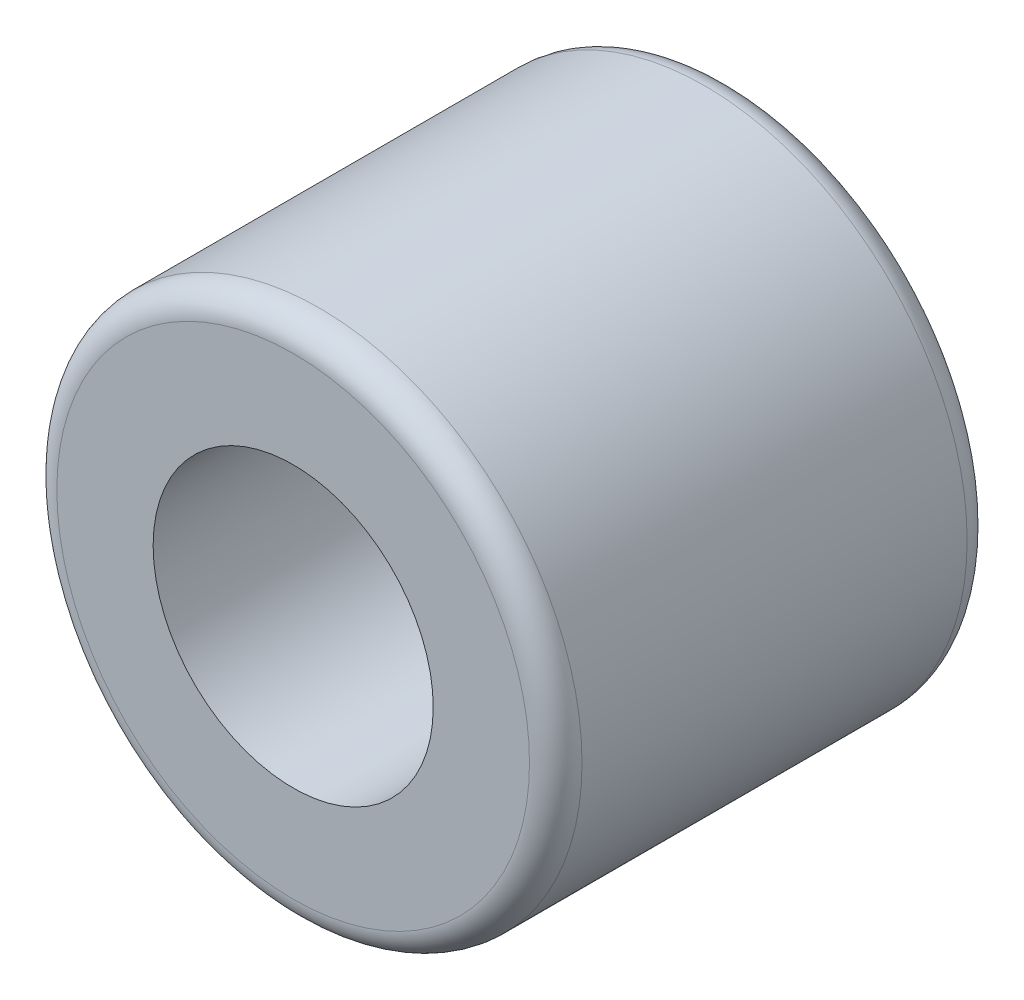
ISO-10303-21;
HEADER;
FILE_DESCRIPTION(('STEP AP214'),'2;1');
FILE_NAME('part.step','',(''),(''),'','','');
FILE_SCHEMA(('AUTOMOTIVE_DESIGN { 1 0 10303 214 1 1 1 1 }'));
ENDSEC;
DATA;
#1=APPLICATION_CONTEXT('core data for automotive mechanical design processes');
#2=APPLICATION_PROTOCOL_DEFINITION('international standard','automotive_design',2000,#1);
#3=PRODUCT_CONTEXT('',#1,'mechanical');
#4=PRODUCT('Part','Part','',(#3));
#5=PRODUCT_RELATED_PRODUCT_CATEGORY('part','',(#4));
#6=PRODUCT_DEFINITION_FORMATION('','',#4);
#7=PRODUCT_DEFINITION_CONTEXT('part definition',#1,'design');
#8=PRODUCT_DEFINITION('design','',#6,#7);
#9=PRODUCT_DEFINITION_SHAPE('','',#8);
#10=(LENGTH_UNIT() NAMED_UNIT(*) SI_UNIT(.MILLI.,.METRE.));
#11=(NAMED_UNIT(*) PLANE_ANGLE_UNIT() SI_UNIT($,.RADIAN.));
#12=(NAMED_UNIT(*) SI_UNIT($,.STERADIAN.) SOLID_ANGLE_UNIT());
#13=UNCERTAINTY_MEASURE_WITH_UNIT(LENGTH_MEASURE(1.E-05),#10,'distance_accuracy_value','');
#14=(GEOMETRIC_REPRESENTATION_CONTEXT(3) GLOBAL_UNCERTAINTY_ASSIGNED_CONTEXT((#13)) GLOBAL_UNIT_ASSIGNED_CONTEXT((#10,
#11,#12)) REPRESENTATION_CONTEXT('',''));
#15=CARTESIAN_POINT('',(0.,0.,0.));
#16=DIRECTION('',(0.,0.,1.));
#17=DIRECTION('',(1.,0.,0.));
#18=AXIS2_PLACEMENT_3D('',#15,#16,#17);
#19=CARTESIAN_POINT('',(0.,0.,5.));
#20=DIRECTION('',(0.,0.,1.));
#21=DIRECTION('',(1.,0.,0.));
#22=AXIS2_PLACEMENT_3D('',#19,#20,#21);
#23=PLANE('',#22);
#24=CARTESIAN_POINT('',(0.,0.,5.));
#25=DIRECTION('',(0.,0.,1.));
#26=DIRECTION('',(1.,0.,0.));
#27=AXIS2_PLACEMENT_3D('',#24,#25,#26);
#28=CIRCLE('',#27,2.7);
#29=CARTESIAN_POINT('',(2.7,0.,5.));
#30=VERTEX_POINT('',#29);
#31=EDGE_CURVE('E10',#30,#30,#28,.T.);
#32=ORIENTED_EDGE('',*,*,#31,.T.);
#33=EDGE_LOOP('',(#32));
#34=FACE_BOUND('',#33,.T.);
#35=CARTESIAN_POINT('',(0.,0.,5.));
#36=DIRECTION('',(0.,0.,1.));
#37=DIRECTION('',(1.,0.,0.));
#38=AXIS2_PLACEMENT_3D('',#35,#36,#37);
#39=CIRCLE('',#38,1.6);
#40=CARTESIAN_POINT('',(1.6,0.,5.));
#41=VERTEX_POINT('',#40);
#42=EDGE_CURVE('E51',#41,#41,#39,.T.);
#43=ORIENTED_EDGE('',*,*,#42,.F.);
#44=EDGE_LOOP('',(#43));
#45=FACE_BOUND('',#44,.T.);
#46=ADVANCED_FACE('F31',(#34,#45),#23,.T.);
#47=CARTESIAN_POINT('',(0.,0.,0.));
#48=DIRECTION('',(0.,0.,1.));
#49=DIRECTION('',(1.,0.,0.));
#50=AXIS2_PLACEMENT_3D('',#47,#48,#49);
#51=PLANE('',#50);
#52=CARTESIAN_POINT('',(0.,0.,0.));
#53=DIRECTION('',(0.,0.,1.));
#54=DIRECTION('',(1.,0.,0.));
#55=AXIS2_PLACEMENT_3D('',#52,#53,#54);
#56=CIRCLE('',#55,2.7);
#57=CARTESIAN_POINT('',(2.7,0.,0.));
#58=VERTEX_POINT('',#57);
#59=EDGE_CURVE('E38',#58,#58,#56,.F.);
#60=ORIENTED_EDGE('',*,*,#59,.T.);
#61=EDGE_LOOP('',(#60));
#62=FACE_BOUND('',#61,.T.);
#63=CARTESIAN_POINT('',(0.,0.,0.));
#64=DIRECTION('',(0.,0.,1.));
#65=DIRECTION('',(1.,0.,0.));
#66=AXIS2_PLACEMENT_3D('',#63,#64,#65);
#67=CIRCLE('',#66,1.6);
#68=CARTESIAN_POINT('',(1.6,0.,0.));
#69=VERTEX_POINT('',#68);
#70=EDGE_CURVE('E52',#69,#69,#67,.T.);
#71=ORIENTED_EDGE('',*,*,#70,.T.);
#72=EDGE_LOOP('',(#71));
#73=FACE_BOUND('',#72,.T.);
#74=ADVANCED_FACE('F62',(#62,#73),#51,.F.);
#75=CARTESIAN_POINT('',(0.,0.,5.));
#76=DIRECTION('',(0.,0.,-1.));
#77=DIRECTION('',(-1.,0.,0.));
#78=AXIS2_PLACEMENT_3D('',#75,#76,#77);
#79=CYLINDRICAL_SURFACE('',#78,3.);
#80=CARTESIAN_POINT('',(0.,0.,0.3));
#81=DIRECTION('',(0.,0.,1.));
#82=DIRECTION('',(1.,0.,0.));
#83=AXIS2_PLACEMENT_3D('',#80,#81,#82);
#84=CIRCLE('',#83,3.);
#85=CARTESIAN_POINT('',(3.,0.,0.3));
#86=VERTEX_POINT('',#85);
#87=EDGE_CURVE('E42',#86,#86,#84,.T.);
#88=ORIENTED_EDGE('',*,*,#87,.T.);
#89=EDGE_LOOP('',(#88));
#90=FACE_BOUND('',#89,.T.);
#91=CARTESIAN_POINT('',(0.,0.,4.7));
#92=DIRECTION('',(0.,0.,1.));
#93=DIRECTION('',(1.,0.,0.));
#94=AXIS2_PLACEMENT_3D('',#91,#92,#93);
#95=CIRCLE('',#94,3.);
#96=CARTESIAN_POINT('',(3.,0.,4.7));
#97=VERTEX_POINT('',#96);
#98=EDGE_CURVE('E46',#97,#97,#95,.F.);
#99=ORIENTED_EDGE('',*,*,#98,.T.);
#100=EDGE_LOOP('',(#99));
#101=FACE_BOUND('',#100,.T.);
#102=ADVANCED_FACE('F67',(#90,#101),#79,.T.);
#103=CARTESIAN_POINT('',(0.,0.,5.));
#104=DIRECTION('',(0.,0.,-1.));
#105=DIRECTION('',(-1.,0.,0.));
#106=AXIS2_PLACEMENT_3D('',#103,#104,#105);
#107=CYLINDRICAL_SURFACE('',#106,1.6);
#108=ORIENTED_EDGE('',*,*,#42,.T.);
#109=EDGE_LOOP('',(#108));
#110=FACE_BOUND('',#109,.T.);
#111=ORIENTED_EDGE('',*,*,#70,.F.);
#112=EDGE_LOOP('',(#111));
#113=FACE_BOUND('',#112,.T.);
#114=ADVANCED_FACE('F58',(#110,#113),#107,.F.);
#115=CARTESIAN_POINT('',(0.,0.,0.3));
#116=DIRECTION('',(0.,0.,1.));
#117=DIRECTION('',(1.,0.,0.));
#118=AXIS2_PLACEMENT_3D('',#115,#116,#117);
#119=TOROIDAL_SURFACE('',#118,2.7,0.3);
#120=ORIENTED_EDGE('',*,*,#59,.F.);
#121=EDGE_LOOP('',(#120));
#122=FACE_BOUND('',#121,.T.);
#123=ORIENTED_EDGE('',*,*,#87,.F.);
#124=EDGE_LOOP('',(#123));
#125=FACE_BOUND('',#124,.T.);
#126=ADVANCED_FACE('F73',(#122,#125),#119,.T.);
#127=CARTESIAN_POINT('',(0.,0.,4.7));
#128=DIRECTION('',(0.,0.,1.));
#129=DIRECTION('',(1.,0.,0.));
#130=AXIS2_PLACEMENT_3D('',#127,#128,#129);
#131=TOROIDAL_SURFACE('',#130,2.7,0.3);
#132=ORIENTED_EDGE('',*,*,#98,.F.);
#133=EDGE_LOOP('',(#132));
#134=FACE_BOUND('',#133,.T.);
#135=ORIENTED_EDGE('',*,*,#31,.F.);
#136=EDGE_LOOP('',(#135));
#137=FACE_BOUND('',#136,.T.);
#138=ADVANCED_FACE('F33',(#134,#137),#131,.T.);
#139=CLOSED_SHELL('',(#46,#74,#102,#114,#126,#138));
#140=MANIFOLD_SOLID_BREP('B2',#139);
#141=ADVANCED_BREP_SHAPE_REPRESENTATION('',(#18,#140),#14);
#142=SHAPE_DEFINITION_REPRESENTATION(#9,#141);
ENDSEC;
END-ISO-10303-21;
